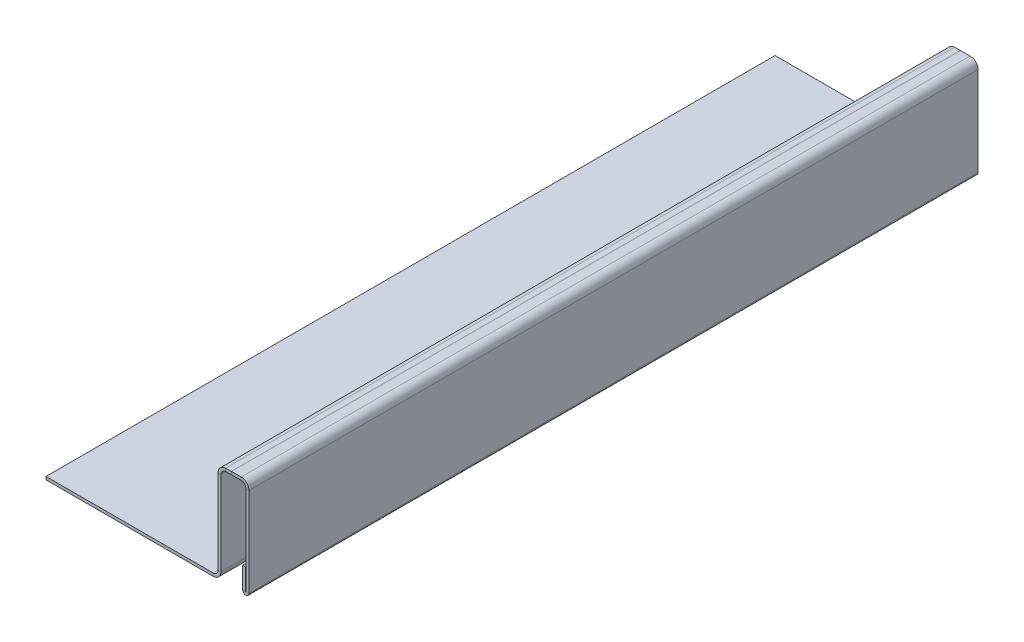
ISO-10303-21;
HEADER;
FILE_DESCRIPTION(('STEP AP214'),'2;1');
FILE_NAME('part.step','',(''),(''),'','','');
FILE_SCHEMA(('AUTOMOTIVE_DESIGN { 1 0 10303 214 1 1 1 1 }'));
ENDSEC;
DATA;
#1=APPLICATION_CONTEXT('core data for automotive mechanical design processes');
#2=APPLICATION_PROTOCOL_DEFINITION('international standard','automotive_design',2000,#1);
#3=PRODUCT_CONTEXT('',#1,'mechanical');
#4=PRODUCT('Part','Part','',(#3));
#5=PRODUCT_RELATED_PRODUCT_CATEGORY('part','',(#4));
#6=PRODUCT_DEFINITION_FORMATION('','',#4);
#7=PRODUCT_DEFINITION_CONTEXT('part definition',#1,'design');
#8=PRODUCT_DEFINITION('design','',#6,#7);
#9=PRODUCT_DEFINITION_SHAPE('','',#8);
#10=(LENGTH_UNIT() NAMED_UNIT(*) SI_UNIT(.MILLI.,.METRE.));
#11=(NAMED_UNIT(*) PLANE_ANGLE_UNIT() SI_UNIT($,.RADIAN.));
#12=(NAMED_UNIT(*) SI_UNIT($,.STERADIAN.) SOLID_ANGLE_UNIT());
#13=UNCERTAINTY_MEASURE_WITH_UNIT(LENGTH_MEASURE(1.E-05),#10,'distance_accuracy_value','');
#14=(GEOMETRIC_REPRESENTATION_CONTEXT(3) GLOBAL_UNCERTAINTY_ASSIGNED_CONTEXT((#13)) GLOBAL_UNIT_ASSIGNED_CONTEXT((#10,
#11,#12)) REPRESENTATION_CONTEXT('',''));
#15=CARTESIAN_POINT('',(0.,0.,0.));
#16=DIRECTION('',(0.,0.,1.));
#17=DIRECTION('',(1.,0.,0.));
#18=AXIS2_PLACEMENT_3D('',#15,#16,#17);
#19=CARTESIAN_POINT('',(0.6,0.,0.));
#20=DIRECTION('',(1.,0.,0.));
#21=DIRECTION('',(0.,0.,-1.));
#22=AXIS2_PLACEMENT_3D('',#19,#20,#21);
#23=PLANE('',#22);
#24=DIRECTION('',(0.,-1.,0.));
#25=VECTOR('',#24,1.);
#26=CARTESIAN_POINT('',(0.6,-40.,75.));
#27=LINE('',#26,#25);
#28=CARTESIAN_POINT('',(0.6,13.7689704673279,74.9999999999999));
#29=VERTEX_POINT('',#28);
#30=CARTESIAN_POINT('',(0.6,-3.56845827696273,75.));
#31=VERTEX_POINT('',#30);
#32=EDGE_CURVE('E62',#29,#31,#27,.T.);
#33=ORIENTED_EDGE('',*,*,#32,.T.);
#34=DIRECTION('',(0.,0.,-1.));
#35=VECTOR('',#34,1.);
#36=CARTESIAN_POINT('',(0.6,-3.56845827696275,0.));
#37=LINE('',#36,#35);
#38=CARTESIAN_POINT('',(0.6,-3.56845827696276,-75.));
#39=VERTEX_POINT('',#38);
#40=EDGE_CURVE('E449',#31,#39,#37,.T.);
#41=ORIENTED_EDGE('',*,*,#40,.T.);
#42=DIRECTION('',(0.,1.,0.));
#43=VECTOR('',#42,1.);
#44=CARTESIAN_POINT('',(0.6,-40.,-75.));
#45=LINE('',#44,#43);
#46=CARTESIAN_POINT('',(0.6,13.7689704673279,-75.));
#47=VERTEX_POINT('',#46);
#48=EDGE_CURVE('E282',#39,#47,#45,.T.);
#49=ORIENTED_EDGE('',*,*,#48,.T.);
#50=DIRECTION('',(0.,0.,1.));
#51=VECTOR('',#50,1.);
#52=CARTESIAN_POINT('',(0.6,13.7689704673279,0.));
#53=LINE('',#52,#51);
#54=EDGE_CURVE('E279',#47,#29,#53,.T.);
#55=ORIENTED_EDGE('',*,*,#54,.T.);
#56=EDGE_LOOP('',(#33,#41,#49,#55));
#57=FACE_BOUND('',#56,.T.);
#58=ADVANCED_FACE('F58',(#57),#23,.T.);
#59=CARTESIAN_POINT('',(-54.1665557150002,12.8221689741547,-75.));
#60=DIRECTION('',(0.,0.,1.));
#61=DIRECTION('',(0.0348994967024975,-0.999390827019096,0.));
#62=AXIS2_PLACEMENT_3D('',#59,#60,#61);
#63=PLANE('',#62);
#64=DIRECTION('',(0.999390827019096,0.0348994967024975,0.));
#65=VECTOR('',#64,1.);
#66=CARTESIAN_POINT('',(-54.1665557150002,12.8221689741547,-75.));
#67=LINE('',#66,#65);
#68=CARTESIAN_POINT('',(1.5651005032975,14.768361294347,-75.));
#69=VERTEX_POINT('',#68);
#70=CARTESIAN_POINT('',(2.7550411574538,14.8099149376397,-75.));
#71=VERTEX_POINT('',#70);
#72=EDGE_CURVE('E308',#69,#71,#67,.T.);
#73=ORIENTED_EDGE('',*,*,#72,.F.);
#74=DIRECTION('',(-0.0348994967024975,0.999390827019096,0.));
#75=VECTOR('',#74,1.);
#76=CARTESIAN_POINT('',(1.5651005032975,14.768361294347,-75.));
#77=LINE('',#76,#75);
#78=CARTESIAN_POINT('',(1.544160805276,15.3679957905585,-75.));
#79=VERTEX_POINT('',#78);
#80=EDGE_CURVE('E446',#69,#79,#77,.T.);
#81=ORIENTED_EDGE('',*,*,#80,.T.);
#82=DIRECTION('',(0.999390827019096,0.0348994967024975,0.));
#83=VECTOR('',#82,1.);
#84=CARTESIAN_POINT('',(-54.1874954130217,13.4218034703662,-75.));
#85=LINE('',#84,#83);
#86=CARTESIAN_POINT('',(2.7341014594323,15.4095494338511,-75.));
#87=VERTEX_POINT('',#86);
#88=EDGE_CURVE('E328',#79,#87,#85,.T.);
#89=ORIENTED_EDGE('',*,*,#88,.T.);
#90=DIRECTION('',(-0.0348994967024975,0.999390827019096,0.));
#91=VECTOR('',#90,1.);
#92=CARTESIAN_POINT('',(2.7550411574538,14.8099149376397,-75.));
#93=LINE('',#92,#91);
#94=EDGE_CURVE('E298',#71,#87,#93,.T.);
#95=ORIENTED_EDGE('',*,*,#94,.F.);
#96=EDGE_LOOP('',(#73,#81,#89,#95));
#97=FACE_BOUND('',#96,.T.);
#98=ADVANCED_FACE('F480',(#97),#63,.F.);
#99=CARTESIAN_POINT('',(-14.2118623322578,14.8177833384661,0.));
#100=DIRECTION('',(0.0348994967024975,-0.999390827019096,0.));
#101=DIRECTION('',(0.,0.,-1.));
#102=AXIS2_PLACEMENT_3D('',#99,#100,#101);
#103=PLANE('',#102);
#104=ORIENTED_EDGE('',*,*,#88,.F.);
#105=DIRECTION('',(0.,0.,1.));
#106=VECTOR('',#105,1.);
#107=CARTESIAN_POINT('',(1.544160805276,15.3679957905585,0.));
#108=LINE('',#107,#106);
#109=CARTESIAN_POINT('',(1.54416080527601,15.3679957905585,75.));
#110=VERTEX_POINT('',#109);
#111=EDGE_CURVE('E443',#79,#110,#108,.T.);
#112=ORIENTED_EDGE('',*,*,#111,.T.);
#113=DIRECTION('',(-0.999390827019096,-0.0348994967024975,0.));
#114=VECTOR('',#113,1.);
#115=CARTESIAN_POINT('',(-54.1874954130217,13.4218034703662,75.));
#116=LINE('',#115,#114);
#117=CARTESIAN_POINT('',(2.73410145943231,15.4095494338511,75.));
#118=VERTEX_POINT('',#117);
#119=EDGE_CURVE('E451',#118,#110,#116,.T.);
#120=ORIENTED_EDGE('',*,*,#119,.F.);
#121=DIRECTION('',(0.,0.,1.));
#122=VECTOR('',#121,1.);
#123=CARTESIAN_POINT('',(2.7341014594323,15.4095494338511,0.));
#124=LINE('',#123,#122);
#125=EDGE_CURVE('E312',#87,#118,#124,.T.);
#126=ORIENTED_EDGE('',*,*,#125,.F.);
#127=EDGE_LOOP('',(#104,#112,#120,#126));
#128=FACE_BOUND('',#127,.T.);
#129=ADVANCED_FACE('F488',(#128),#103,.F.);
#130=CARTESIAN_POINT('',(-54.1665557150002,12.8221689741547,75.));
#131=DIRECTION('',(0.,0.,-1.));
#132=DIRECTION('',(-0.0348994967024975,0.999390827019096,0.));
#133=AXIS2_PLACEMENT_3D('',#130,#131,#132);
#134=PLANE('',#133);
#135=ORIENTED_EDGE('',*,*,#119,.T.);
#136=DIRECTION('',(0.0348994967024975,-0.999390827019096,0.));
#137=VECTOR('',#136,1.);
#138=CARTESIAN_POINT('',(1.5651005032975,14.768361294347,75.));
#139=LINE('',#138,#137);
#140=CARTESIAN_POINT('',(1.5651005032975,14.768361294347,74.9999999999999));
#141=VERTEX_POINT('',#140);
#142=EDGE_CURVE('E441',#110,#141,#139,.T.);
#143=ORIENTED_EDGE('',*,*,#142,.T.);
#144=DIRECTION('',(-0.999390827019096,-0.0348994967024975,0.));
#145=VECTOR('',#144,1.);
#146=CARTESIAN_POINT('',(-54.1665557150002,12.8221689741547,75.));
#147=LINE('',#146,#145);
#148=CARTESIAN_POINT('',(2.7550411574538,14.8099149376397,75.));
#149=VERTEX_POINT('',#148);
#150=EDGE_CURVE('E307',#149,#141,#147,.T.);
#151=ORIENTED_EDGE('',*,*,#150,.F.);
#152=DIRECTION('',(0.0348994967024975,-0.999390827019096,0.));
#153=VECTOR('',#152,1.);
#154=CARTESIAN_POINT('',(2.7550411574538,14.8099149376397,75.));
#155=LINE('',#154,#153);
#156=EDGE_CURVE('E309',#118,#149,#155,.T.);
#157=ORIENTED_EDGE('',*,*,#156,.F.);
#158=EDGE_LOOP('',(#135,#143,#151,#157));
#159=FACE_BOUND('',#158,.T.);
#160=ADVANCED_FACE('F493',(#159),#134,.F.);
#161=CARTESIAN_POINT('',(-54.211731013703,14.8105241106208,-75.));
#162=DIRECTION('',(0.,0.,1.));
#163=DIRECTION('',(0.,-1.,0.));
#164=AXIS2_PLACEMENT_3D('',#161,#162,#163);
#165=PLANE('',#164);
#166=DIRECTION('',(1.,0.,0.));
#167=VECTOR('',#166,1.);
#168=CARTESIAN_POINT('',(-54.211731013703,14.8105241106208,-75.));
#169=LINE('',#168,#167);
#170=CARTESIAN_POINT('',(2.7899406541563,14.8105241106206,-75.));
#171=VERTEX_POINT('',#170);
#172=CARTESIAN_POINT('',(4.76725137388036,14.8105241106206,-75.));
#173=VERTEX_POINT('',#172);
#174=EDGE_CURVE('E335',#171,#173,#169,.T.);
#175=ORIENTED_EDGE('',*,*,#174,.F.);
#176=DIRECTION('',(0.,1.,0.));
#177=VECTOR('',#176,1.);
#178=CARTESIAN_POINT('',(2.7899406541563,14.8105241106206,-75.));
#179=LINE('',#178,#177);
#180=CARTESIAN_POINT('',(2.7899406541563,15.4105241106206,-75.));
#181=VERTEX_POINT('',#180);
#182=EDGE_CURVE('E429',#171,#181,#179,.T.);
#183=ORIENTED_EDGE('',*,*,#182,.T.);
#184=DIRECTION('',(1.,0.,0.));
#185=VECTOR('',#184,1.);
#186=CARTESIAN_POINT('',(-54.211731013703,15.4105241106208,-75.));
#187=LINE('',#186,#185);
#188=CARTESIAN_POINT('',(4.76725137388036,15.4105241106206,-75.));
#189=VERTEX_POINT('',#188);
#190=EDGE_CURVE('E363',#181,#189,#187,.T.);
#191=ORIENTED_EDGE('',*,*,#190,.T.);
#192=DIRECTION('',(0.,1.,0.));
#193=VECTOR('',#192,1.);
#194=CARTESIAN_POINT('',(4.76725137388036,14.8105241106206,-75.));
#195=LINE('',#194,#193);
#196=EDGE_CURVE('E324',#173,#189,#195,.T.);
#197=ORIENTED_EDGE('',*,*,#196,.F.);
#198=EDGE_LOOP('',(#175,#183,#191,#197));
#199=FACE_BOUND('',#198,.T.);
#200=ADVANCED_FACE('F511',(#199),#165,.F.);
#201=CARTESIAN_POINT('',(-14.211731013703,15.4105241106206,0.));
#202=DIRECTION('',(0.,-1.,0.));
#203=DIRECTION('',(0.,0.,-1.));
#204=AXIS2_PLACEMENT_3D('',#201,#202,#203);
#205=PLANE('',#204);
#206=ORIENTED_EDGE('',*,*,#190,.F.);
#207=DIRECTION('',(0.,0.,1.));
#208=VECTOR('',#207,1.);
#209=CARTESIAN_POINT('',(2.7899406541563,15.4105241106206,0.));
#210=LINE('',#209,#208);
#211=CARTESIAN_POINT('',(2.78994065415631,15.4105241106206,75.));
#212=VERTEX_POINT('',#211);
#213=EDGE_CURVE('E426',#181,#212,#210,.T.);
#214=ORIENTED_EDGE('',*,*,#213,.T.);
#215=DIRECTION('',(-1.,0.,0.));
#216=VECTOR('',#215,1.);
#217=CARTESIAN_POINT('',(-54.211731013703,15.4105241106208,75.));
#218=LINE('',#217,#216);
#219=CARTESIAN_POINT('',(4.76725137388038,15.4105241106206,75.));
#220=VERTEX_POINT('',#219);
#221=EDGE_CURVE('E434',#220,#212,#218,.T.);
#222=ORIENTED_EDGE('',*,*,#221,.F.);
#223=DIRECTION('',(0.,0.,1.));
#224=VECTOR('',#223,1.);
#225=CARTESIAN_POINT('',(4.76725137388037,15.4105241106206,0.));
#226=LINE('',#225,#224);
#227=EDGE_CURVE('E339',#189,#220,#226,.T.);
#228=ORIENTED_EDGE('',*,*,#227,.F.);
#229=EDGE_LOOP('',(#206,#214,#222,#228));
#230=FACE_BOUND('',#229,.T.);
#231=ADVANCED_FACE('F520',(#230),#205,.F.);
#232=CARTESIAN_POINT('',(-54.211731013703,14.8105241106208,75.));
#233=DIRECTION('',(0.,0.,-1.));
#234=DIRECTION('',(0.,1.,0.));
#235=AXIS2_PLACEMENT_3D('',#232,#233,#234);
#236=PLANE('',#235);
#237=ORIENTED_EDGE('',*,*,#221,.T.);
#238=DIRECTION('',(0.,-1.,0.));
#239=VECTOR('',#238,1.);
#240=CARTESIAN_POINT('',(2.7899406541563,14.8105241106206,75.));
#241=LINE('',#240,#239);
#242=CARTESIAN_POINT('',(2.7899406541563,14.8105241106206,75.));
#243=VERTEX_POINT('',#242);
#244=EDGE_CURVE('E424',#212,#243,#241,.T.);
#245=ORIENTED_EDGE('',*,*,#244,.T.);
#246=DIRECTION('',(-1.,0.,0.));
#247=VECTOR('',#246,1.);
#248=CARTESIAN_POINT('',(-54.211731013703,14.8105241106208,75.));
#249=LINE('',#248,#247);
#250=CARTESIAN_POINT('',(4.76725137388036,14.8105241106206,75.));
#251=VERTEX_POINT('',#250);
#252=EDGE_CURVE('E334',#251,#243,#249,.T.);
#253=ORIENTED_EDGE('',*,*,#252,.F.);
#254=DIRECTION('',(0.,-1.,0.));
#255=VECTOR('',#254,1.);
#256=CARTESIAN_POINT('',(4.76725137388036,14.8105241106206,75.));
#257=LINE('',#256,#255);
#258=EDGE_CURVE('E336',#220,#251,#257,.T.);
#259=ORIENTED_EDGE('',*,*,#258,.F.);
#260=EDGE_LOOP('',(#237,#245,#253,#259));
#261=FACE_BOUND('',#260,.T.);
#262=ADVANCED_FACE('F524',(#261),#236,.F.);
#263=CARTESIAN_POINT('',(6.36725137388052,34.8315417230373,0.));
#264=DIRECTION('',(-1.,0.,0.));
#265=DIRECTION('',(0.,0.,-1.));
#266=AXIS2_PLACEMENT_3D('',#263,#264,#265);
#267=PLANE('',#266);
#268=DIRECTION('',(0.,-1.,0.));
#269=VECTOR('',#268,1.);
#270=CARTESIAN_POINT('',(6.3672513738808,74.8315417230373,-75.));
#271=LINE('',#270,#269);
#272=CARTESIAN_POINT('',(6.36725137388037,13.8105241106206,-75.));
#273=VERTEX_POINT('',#272);
#274=CARTESIAN_POINT('',(6.36725137388024,-4.51845827696273,-75.));
#275=VERTEX_POINT('',#274);
#276=EDGE_CURVE('E415',#273,#275,#271,.T.);
#277=ORIENTED_EDGE('',*,*,#276,.F.);
#278=DIRECTION('',(0.,0.,1.));
#279=VECTOR('',#278,1.);
#280=CARTESIAN_POINT('',(6.36725137388037,13.8105241106206,0.));
#281=LINE('',#280,#279);
#282=CARTESIAN_POINT('',(6.36725137388037,13.8105241106205,75.));
#283=VERTEX_POINT('',#282);
#284=EDGE_CURVE('E408',#273,#283,#281,.T.);
#285=ORIENTED_EDGE('',*,*,#284,.T.);
#286=DIRECTION('',(0.,1.,0.));
#287=VECTOR('',#286,1.);
#288=CARTESIAN_POINT('',(6.3672513738808,74.8315417230372,75.));
#289=LINE('',#288,#287);
#290=CARTESIAN_POINT('',(6.36725137388025,-4.51845827696277,75.));
#291=VERTEX_POINT('',#290);
#292=EDGE_CURVE('E400',#291,#283,#289,.T.);
#293=ORIENTED_EDGE('',*,*,#292,.F.);
#294=DIRECTION('',(0.,0.,1.));
#295=VECTOR('',#294,1.);
#296=CARTESIAN_POINT('',(6.36725137388025,-4.51845827696277,75.));
#297=LINE('',#296,#295);
#298=EDGE_CURVE('E344',#291,#275,#297,.F.);
#299=ORIENTED_EDGE('',*,*,#298,.T.);
#300=EDGE_LOOP('',(#277,#285,#293,#299));
#301=FACE_BOUND('',#300,.T.);
#302=ADVANCED_FACE('F552',(#301),#267,.F.);
#303=CARTESIAN_POINT('',(5.7672513738808,74.8315417230373,-75.));
#304=DIRECTION('',(0.,0.,1.));
#305=DIRECTION('',(-1.,0.,0.));
#306=AXIS2_PLACEMENT_3D('',#303,#304,#305);
#307=PLANE('',#306);
#308=DIRECTION('',(0.,-1.,0.));
#309=VECTOR('',#308,1.);
#310=CARTESIAN_POINT('',(5.7672513738808,74.8315417230373,-75.));
#311=LINE('',#310,#309);
#312=CARTESIAN_POINT('',(5.76725137388037,13.8105241106206,-75.));
#313=VERTEX_POINT('',#312);
#314=CARTESIAN_POINT('',(5.76725137388024,-4.51845827696273,-75.));
#315=VERTEX_POINT('',#314);
#316=EDGE_CURVE('E406',#313,#315,#311,.T.);
#317=ORIENTED_EDGE('',*,*,#316,.F.);
#318=DIRECTION('',(1.,0.,0.));
#319=VECTOR('',#318,1.);
#320=CARTESIAN_POINT('',(5.76725137388037,13.8105241106206,-75.));
#321=LINE('',#320,#319);
#322=EDGE_CURVE('E411',#313,#273,#321,.T.);
#323=ORIENTED_EDGE('',*,*,#322,.T.);
#324=ORIENTED_EDGE('',*,*,#276,.T.);
#325=DIRECTION('',(1.,0.,0.));
#326=VECTOR('',#325,1.);
#327=CARTESIAN_POINT('',(5.76725137388024,-4.51845827696273,-75.));
#328=LINE('',#327,#326);
#329=EDGE_CURVE('E364',#315,#275,#328,.T.);
#330=ORIENTED_EDGE('',*,*,#329,.F.);
#331=EDGE_LOOP('',(#317,#323,#324,#330));
#332=FACE_BOUND('',#331,.T.);
#333=ADVANCED_FACE('F549',(#332),#307,.F.);
#334=CARTESIAN_POINT('',(5.7672513738808,74.8315417230372,75.));
#335=DIRECTION('',(0.,0.,-1.));
#336=DIRECTION('',(1.,0.,0.));
#337=AXIS2_PLACEMENT_3D('',#334,#335,#336);
#338=PLANE('',#337);
#339=ORIENTED_EDGE('',*,*,#292,.T.);
#340=DIRECTION('',(-1.,0.,0.));
#341=VECTOR('',#340,1.);
#342=CARTESIAN_POINT('',(5.76725137388037,13.8105241106206,75.));
#343=LINE('',#342,#341);
#344=CARTESIAN_POINT('',(5.76725137388036,13.8105241106205,75.));
#345=VERTEX_POINT('',#344);
#346=EDGE_CURVE('E405',#283,#345,#343,.T.);
#347=ORIENTED_EDGE('',*,*,#346,.T.);
#348=DIRECTION('',(0.,1.,0.));
#349=VECTOR('',#348,1.);
#350=CARTESIAN_POINT('',(5.7672513738808,74.8315417230372,75.));
#351=LINE('',#350,#349);
#352=CARTESIAN_POINT('',(5.76725137388024,-4.51845827696276,75.));
#353=VERTEX_POINT('',#352);
#354=EDGE_CURVE('E417',#353,#345,#351,.T.);
#355=ORIENTED_EDGE('',*,*,#354,.F.);
#356=DIRECTION('',(1.,0.,0.));
#357=VECTOR('',#356,1.);
#358=CARTESIAN_POINT('',(5.76725137388024,-4.51845827696276,75.));
#359=LINE('',#358,#357);
#360=EDGE_CURVE('E351',#353,#291,#359,.T.);
#361=ORIENTED_EDGE('',*,*,#360,.T.);
#362=EDGE_LOOP('',(#339,#347,#355,#361));
#363=FACE_BOUND('',#362,.T.);
#364=ADVANCED_FACE('F536',(#363),#338,.F.);
#365=CARTESIAN_POINT('',(5.76725137388052,34.8315417230373,0.));
#366=DIRECTION('',(-1.,0.,0.));
#367=DIRECTION('',(0.,0.,-1.));
#368=AXIS2_PLACEMENT_3D('',#365,#366,#367);
#369=PLANE('',#368);
#370=DIRECTION('',(0.,0.,1.));
#371=VECTOR('',#370,1.);
#372=CARTESIAN_POINT('',(5.76725137388037,13.8105241106206,0.));
#373=LINE('',#372,#371);
#374=EDGE_CURVE('E402',#313,#345,#373,.T.);
#375=ORIENTED_EDGE('',*,*,#374,.F.);
#376=ORIENTED_EDGE('',*,*,#316,.T.);
#377=DIRECTION('',(0.,0.,1.));
#378=VECTOR('',#377,1.);
#379=CARTESIAN_POINT('',(5.76725137388024,-4.51845827696276,75.));
#380=LINE('',#379,#378);
#381=EDGE_CURVE('E357',#353,#315,#380,.F.);
#382=ORIENTED_EDGE('',*,*,#381,.F.);
#383=ORIENTED_EDGE('',*,*,#354,.T.);
#384=EDGE_LOOP('',(#375,#376,#382,#383));
#385=FACE_BOUND('',#384,.T.);
#386=ADVANCED_FACE('F540',(#385),#369,.T.);
#387=CARTESIAN_POINT('',(5.06725137388026,-2.34345827696275,75.));
#388=DIRECTION('',(0.,0.,-1.));
#389=DIRECTION('',(0.,-1.,0.));
#390=AXIS2_PLACEMENT_3D('',#387,#388,#389);
#391=PLANE('',#390);
#392=DIRECTION('',(-1.,0.,0.));
#393=VECTOR('',#392,1.);
#394=CARTESIAN_POINT('',(5.06725137388025,-4.51845827696275,75.));
#395=LINE('',#394,#393);
#396=CARTESIAN_POINT('',(5.66725137388024,-4.51845827696277,75.));
#397=VERTEX_POINT('',#396);
#398=CARTESIAN_POINT('',(5.06725137388025,-4.51845827696275,75.));
#399=VERTEX_POINT('',#398);
#400=EDGE_CURVE('E394',#397,#399,#395,.T.);
#401=ORIENTED_EDGE('',*,*,#400,.F.);
#402=DIRECTION('',(0.,-1.,0.));
#403=VECTOR('',#402,1.);
#404=CARTESIAN_POINT('',(5.66725137388026,-2.34345827696277,75.));
#405=LINE('',#404,#403);
#406=CARTESIAN_POINT('',(5.66725137388027,-0.168458276962756,75.));
#407=VERTEX_POINT('',#406);
#408=EDGE_CURVE('E385',#407,#397,#405,.T.);
#409=ORIENTED_EDGE('',*,*,#408,.F.);
#410=DIRECTION('',(-1.,0.,0.));
#411=VECTOR('',#410,1.);
#412=CARTESIAN_POINT('',(5.06725137388028,-0.168458276962751,75.));
#413=LINE('',#412,#411);
#414=CARTESIAN_POINT('',(5.06725137388028,-0.168458276962751,75.));
#415=VERTEX_POINT('',#414);
#416=EDGE_CURVE('E392',#407,#415,#413,.T.);
#417=ORIENTED_EDGE('',*,*,#416,.T.);
#418=DIRECTION('',(0.,-1.,0.));
#419=VECTOR('',#418,1.);
#420=CARTESIAN_POINT('',(5.06725137388026,-2.34345827696275,75.));
#421=LINE('',#420,#419);
#422=EDGE_CURVE('E373',#415,#399,#421,.T.);
#423=ORIENTED_EDGE('',*,*,#422,.T.);
#424=EDGE_LOOP('',(#401,#409,#417,#423));
#425=FACE_BOUND('',#424,.T.);
#426=ADVANCED_FACE('F567',(#425),#391,.F.);
#427=CARTESIAN_POINT('',(5.06725137388027,-0.168458276962741,0.));
#428=DIRECTION('',(0.,-1.,0.));
#429=DIRECTION('',(0.,0.,1.));
#430=AXIS2_PLACEMENT_3D('',#427,#428,#429);
#431=PLANE('',#430);
#432=ORIENTED_EDGE('',*,*,#416,.F.);
#433=DIRECTION('',(0.,0.,-1.));
#434=VECTOR('',#433,1.);
#435=CARTESIAN_POINT('',(5.66725137388027,-0.168458276962755,0.));
#436=LINE('',#435,#434);
#437=CARTESIAN_POINT('',(5.66725137388027,-0.168458276962742,-75.));
#438=VERTEX_POINT('',#437);
#439=EDGE_CURVE('E382',#438,#407,#436,.F.);
#440=ORIENTED_EDGE('',*,*,#439,.F.);
#441=DIRECTION('',(-1.,0.,0.));
#442=VECTOR('',#441,1.);
#443=CARTESIAN_POINT('',(5.06725137388027,-0.168458276962732,-75.));
#444=LINE('',#443,#442);
#445=CARTESIAN_POINT('',(5.06725137388027,-0.168458276962732,-75.));
#446=VERTEX_POINT('',#445);
#447=EDGE_CURVE('E372',#438,#446,#444,.T.);
#448=ORIENTED_EDGE('',*,*,#447,.T.);
#449=DIRECTION('',(0.,0.,1.));
#450=VECTOR('',#449,1.);
#451=CARTESIAN_POINT('',(5.06725137388027,-0.168458276962741,0.));
#452=LINE('',#451,#450);
#453=EDGE_CURVE('E369',#446,#415,#452,.T.);
#454=ORIENTED_EDGE('',*,*,#453,.T.);
#455=EDGE_LOOP('',(#432,#440,#448,#454));
#456=FACE_BOUND('',#455,.T.);
#457=ADVANCED_FACE('F582',(#456),#431,.F.);
#458=CARTESIAN_POINT('',(5.06725137388026,-2.34345827696273,-75.));
#459=DIRECTION('',(0.,0.,1.));
#460=DIRECTION('',(0.,1.,0.));
#461=AXIS2_PLACEMENT_3D('',#458,#459,#460);
#462=PLANE('',#461);
#463=DIRECTION('',(0.,-1.,0.));
#464=VECTOR('',#463,1.);
#465=CARTESIAN_POINT('',(5.66725137388026,-2.34345827696273,-75.));
#466=LINE('',#465,#464);
#467=CARTESIAN_POINT('',(5.66725137388024,-4.51845827696275,-75.));
#468=VERTEX_POINT('',#467);
#469=EDGE_CURVE('E367',#468,#438,#466,.F.);
#470=ORIENTED_EDGE('',*,*,#469,.F.);
#471=DIRECTION('',(-1.,0.,0.));
#472=VECTOR('',#471,1.);
#473=CARTESIAN_POINT('',(5.06725137388025,-4.51845827696273,-75.));
#474=LINE('',#473,#472);
#475=CARTESIAN_POINT('',(5.06725137388025,-4.51845827696272,-75.));
#476=VERTEX_POINT('',#475);
#477=EDGE_CURVE('E397',#468,#476,#474,.T.);
#478=ORIENTED_EDGE('',*,*,#477,.T.);
#479=DIRECTION('',(0.,1.,0.));
#480=VECTOR('',#479,1.);
#481=CARTESIAN_POINT('',(5.06725137388026,-2.34345827696273,-75.));
#482=LINE('',#481,#480);
#483=EDGE_CURVE('E379',#476,#446,#482,.T.);
#484=ORIENTED_EDGE('',*,*,#483,.T.);
#485=ORIENTED_EDGE('',*,*,#447,.F.);
#486=EDGE_LOOP('',(#470,#478,#484,#485));
#487=FACE_BOUND('',#486,.T.);
#488=ADVANCED_FACE('F580',(#487),#462,.F.);
#489=CARTESIAN_POINT('',(5.06725137388026,-2.34345827696274,0.));
#490=DIRECTION('',(-1.,0.,0.));
#491=DIRECTION('',(0.,0.,-1.));
#492=AXIS2_PLACEMENT_3D('',#489,#490,#491);
#493=PLANE('',#492);
#494=ORIENTED_EDGE('',*,*,#453,.F.);
#495=ORIENTED_EDGE('',*,*,#483,.F.);
#496=DIRECTION('',(0.,0.,-1.));
#497=VECTOR('',#496,1.);
#498=CARTESIAN_POINT('',(5.06725137388025,-4.51845827696274,0.));
#499=LINE('',#498,#497);
#500=EDGE_CURVE('E376',#399,#476,#499,.T.);
#501=ORIENTED_EDGE('',*,*,#500,.F.);
#502=ORIENTED_EDGE('',*,*,#422,.F.);
#503=EDGE_LOOP('',(#494,#495,#501,#502));
#504=FACE_BOUND('',#503,.T.);
#505=ADVANCED_FACE('F565',(#504),#493,.T.);
#506=CARTESIAN_POINT('',(5.66725137388026,-2.34345827696275,0.));
#507=DIRECTION('',(-1.,0.,0.));
#508=DIRECTION('',(0.,0.,-1.));
#509=AXIS2_PLACEMENT_3D('',#506,#507,#508);
#510=PLANE('',#509);
#511=ORIENTED_EDGE('',*,*,#439,.T.);
#512=ORIENTED_EDGE('',*,*,#408,.T.);
#513=DIRECTION('',(0.,0.,-1.));
#514=VECTOR('',#513,1.);
#515=CARTESIAN_POINT('',(5.66725137388024,-4.51845827696275,0.));
#516=LINE('',#515,#514);
#517=EDGE_CURVE('E388',#397,#468,#516,.T.);
#518=ORIENTED_EDGE('',*,*,#517,.T.);
#519=ORIENTED_EDGE('',*,*,#469,.T.);
#520=EDGE_LOOP('',(#511,#512,#518,#519));
#521=FACE_BOUND('',#520,.T.);
#522=ADVANCED_FACE('F577',(#521),#510,.F.);
#523=CARTESIAN_POINT('',(5.71725137388024,-4.51845827696273,-75.));
#524=DIRECTION('',(0.,0.,-1.));
#525=DIRECTION('',(1.,0.,0.));
#526=AXIS2_PLACEMENT_3D('',#523,#524,#525);
#527=PLANE('',#526);
#528=ORIENTED_EDGE('',*,*,#477,.F.);
#529=CARTESIAN_POINT('',(5.71725137388024,-4.51845827696273,-75.));
#530=DIRECTION('',(0.,0.,1.));
#531=DIRECTION('',(-1.,0.,0.));
#532=AXIS2_PLACEMENT_3D('',#529,#530,#531);
#533=CIRCLE('',#532,0.05);
#534=EDGE_CURVE('E354',#315,#468,#533,.F.);
#535=ORIENTED_EDGE('',*,*,#534,.F.);
#536=ORIENTED_EDGE('',*,*,#329,.T.);
#537=CARTESIAN_POINT('',(5.71725137388024,-4.51845827696273,-75.));
#538=DIRECTION('',(0.,0.,1.));
#539=DIRECTION('',(-1.,0.,0.));
#540=AXIS2_PLACEMENT_3D('',#537,#538,#539);
#541=CIRCLE('',#540,0.65);
#542=EDGE_CURVE('E347',#275,#476,#541,.F.);
#543=ORIENTED_EDGE('',*,*,#542,.T.);
#544=EDGE_LOOP('',(#528,#535,#536,#543));
#545=FACE_BOUND('',#544,.T.);
#546=ADVANCED_FACE('F560',(#545),#527,.T.);
#547=CARTESIAN_POINT('',(5.71725137388024,-4.51845827696277,75.));
#548=DIRECTION('',(0.,0.,-1.));
#549=DIRECTION('',(1.,0.,0.));
#550=AXIS2_PLACEMENT_3D('',#547,#548,#549);
#551=PLANE('',#550);
#552=CARTESIAN_POINT('',(5.71725137388024,-4.51845827696277,75.));
#553=DIRECTION('',(0.,0.,1.));
#554=DIRECTION('',(-1.,0.,0.));
#555=AXIS2_PLACEMENT_3D('',#552,#553,#554);
#556=CIRCLE('',#555,0.05);
#557=EDGE_CURVE('E360',#397,#353,#556,.T.);
#558=ORIENTED_EDGE('',*,*,#557,.F.);
#559=ORIENTED_EDGE('',*,*,#400,.T.);
#560=CARTESIAN_POINT('',(5.71725137388024,-4.51845827696277,75.));
#561=DIRECTION('',(0.,0.,1.));
#562=DIRECTION('',(-1.,0.,0.));
#563=AXIS2_PLACEMENT_3D('',#560,#561,#562);
#564=CIRCLE('',#563,0.65);
#565=EDGE_CURVE('E348',#399,#291,#564,.T.);
#566=ORIENTED_EDGE('',*,*,#565,.T.);
#567=ORIENTED_EDGE('',*,*,#360,.F.);
#568=EDGE_LOOP('',(#558,#559,#566,#567));
#569=FACE_BOUND('',#568,.T.);
#570=ADVANCED_FACE('F571',(#569),#551,.F.);
#571=CARTESIAN_POINT('',(5.71725137388024,-4.51845827696277,75.));
#572=DIRECTION('',(0.,0.,1.));
#573=DIRECTION('',(-1.,0.,0.));
#574=AXIS2_PLACEMENT_3D('',#571,#572,#573);
#575=CYLINDRICAL_SURFACE('',#574,0.65);
#576=ORIENTED_EDGE('',*,*,#298,.F.);
#577=ORIENTED_EDGE('',*,*,#565,.F.);
#578=ORIENTED_EDGE('',*,*,#500,.T.);
#579=ORIENTED_EDGE('',*,*,#542,.F.);
#580=EDGE_LOOP('',(#576,#577,#578,#579));
#581=FACE_BOUND('',#580,.T.);
#582=ADVANCED_FACE('F561',(#581),#575,.T.);
#583=CARTESIAN_POINT('',(5.71725137388024,-4.51845827696277,75.));
#584=DIRECTION('',(0.,0.,1.));
#585=DIRECTION('',(-1.,0.,0.));
#586=AXIS2_PLACEMENT_3D('',#583,#584,#585);
#587=CYLINDRICAL_SURFACE('',#586,0.05);
#588=ORIENTED_EDGE('',*,*,#381,.T.);
#589=ORIENTED_EDGE('',*,*,#534,.T.);
#590=ORIENTED_EDGE('',*,*,#517,.F.);
#591=ORIENTED_EDGE('',*,*,#557,.T.);
#592=EDGE_LOOP('',(#588,#589,#590,#591));
#593=FACE_BOUND('',#592,.T.);
#594=ADVANCED_FACE('F574',(#593),#587,.F.);
#595=CARTESIAN_POINT('',(-14.211731013703,14.8105241106206,0.));
#596=DIRECTION('',(0.,-1.,0.));
#597=DIRECTION('',(0.,0.,-1.));
#598=AXIS2_PLACEMENT_3D('',#595,#596,#597);
#599=PLANE('',#598);
#600=DIRECTION('',(0.,0.,1.));
#601=VECTOR('',#600,1.);
#602=CARTESIAN_POINT('',(2.7899406541563,14.8105241106206,0.));
#603=LINE('',#602,#601);
#604=EDGE_CURVE('E414',#171,#243,#603,.T.);
#605=ORIENTED_EDGE('',*,*,#604,.F.);
#606=ORIENTED_EDGE('',*,*,#174,.T.);
#607=DIRECTION('',(0.,0.,1.));
#608=VECTOR('',#607,1.);
#609=CARTESIAN_POINT('',(4.76725137388036,14.8105241106206,0.));
#610=LINE('',#609,#608);
#611=EDGE_CURVE('E331',#173,#251,#610,.T.);
#612=ORIENTED_EDGE('',*,*,#611,.T.);
#613=ORIENTED_EDGE('',*,*,#252,.T.);
#614=EDGE_LOOP('',(#605,#606,#612,#613));
#615=FACE_BOUND('',#614,.T.);
#616=ADVANCED_FACE('F507',(#615),#599,.T.);
#617=CARTESIAN_POINT('',(4.76725137388036,13.8105241106206,-75.));
#618=DIRECTION('',(0.,0.,1.));
#619=DIRECTION('',(0.,-1.,0.));
#620=AXIS2_PLACEMENT_3D('',#617,#618,#619);
#621=PLANE('',#620);
#622=ORIENTED_EDGE('',*,*,#196,.T.);
#623=CARTESIAN_POINT('',(4.76725137388035,13.8105241106206,-75.));
#624=DIRECTION('',(0.,0.,1.));
#625=DIRECTION('',(-1.,0.,0.));
#626=AXIS2_PLACEMENT_3D('',#623,#624,#625);
#627=CIRCLE('',#626,1.6);
#628=EDGE_CURVE('E325',#189,#273,#627,.F.);
#629=ORIENTED_EDGE('',*,*,#628,.T.);
#630=ORIENTED_EDGE('',*,*,#322,.F.);
#631=CARTESIAN_POINT('',(4.76725137388036,13.8105241106206,-75.));
#632=DIRECTION('',(0.,0.,-1.));
#633=DIRECTION('',(0.,1.,0.));
#634=AXIS2_PLACEMENT_3D('',#631,#632,#633);
#635=CIRCLE('',#634,0.999999999999999);
#636=EDGE_CURVE('E317',#173,#313,#635,.T.);
#637=ORIENTED_EDGE('',*,*,#636,.F.);
#638=EDGE_LOOP('',(#622,#629,#630,#637));
#639=FACE_BOUND('',#638,.T.);
#640=ADVANCED_FACE('F547',(#639),#621,.F.);
#641=CARTESIAN_POINT('',(4.76725137388036,13.8105241106206,75.));
#642=DIRECTION('',(0.,0.,-1.));
#643=DIRECTION('',(0.,1.,0.));
#644=AXIS2_PLACEMENT_3D('',#641,#642,#643);
#645=PLANE('',#644);
#646=CARTESIAN_POINT('',(4.76725137388036,13.8105241106206,75.));
#647=DIRECTION('',(0.,0.,1.));
#648=DIRECTION('',(-1.,0.,0.));
#649=AXIS2_PLACEMENT_3D('',#646,#647,#648);
#650=CIRCLE('',#649,1.6);
#651=EDGE_CURVE('E321',#283,#220,#650,.T.);
#652=ORIENTED_EDGE('',*,*,#651,.T.);
#653=ORIENTED_EDGE('',*,*,#258,.T.);
#654=CARTESIAN_POINT('',(4.76725137388036,13.8105241106206,75.));
#655=DIRECTION('',(0.,0.,1.));
#656=DIRECTION('',(0.,-1.,0.));
#657=AXIS2_PLACEMENT_3D('',#654,#655,#656);
#658=CIRCLE('',#657,1.);
#659=EDGE_CURVE('E320',#345,#251,#658,.T.);
#660=ORIENTED_EDGE('',*,*,#659,.F.);
#661=ORIENTED_EDGE('',*,*,#346,.F.);
#662=EDGE_LOOP('',(#652,#653,#660,#661));
#663=FACE_BOUND('',#662,.T.);
#664=ADVANCED_FACE('F533',(#663),#645,.F.);
#665=CARTESIAN_POINT('',(4.76725137388036,13.8105241106206,-150.015098932939));
#666=DIRECTION('',(0.,0.,1.));
#667=DIRECTION('',(-1.,0.,0.));
#668=AXIS2_PLACEMENT_3D('',#665,#666,#667);
#669=CYLINDRICAL_SURFACE('',#668,1.);
#670=ORIENTED_EDGE('',*,*,#374,.T.);
#671=ORIENTED_EDGE('',*,*,#659,.T.);
#672=ORIENTED_EDGE('',*,*,#611,.F.);
#673=ORIENTED_EDGE('',*,*,#636,.T.);
#674=EDGE_LOOP('',(#670,#671,#672,#673));
#675=FACE_BOUND('',#674,.T.);
#676=ADVANCED_FACE('F543',(#675),#669,.F.);
#677=CARTESIAN_POINT('',(4.76725137388036,13.8105241106206,-150.015098932939));
#678=DIRECTION('',(0.,0.,1.));
#679=DIRECTION('',(-1.,0.,0.));
#680=AXIS2_PLACEMENT_3D('',#677,#678,#679);
#681=CYLINDRICAL_SURFACE('',#680,1.6);
#682=ORIENTED_EDGE('',*,*,#284,.F.);
#683=ORIENTED_EDGE('',*,*,#628,.F.);
#684=ORIENTED_EDGE('',*,*,#227,.T.);
#685=ORIENTED_EDGE('',*,*,#651,.F.);
#686=EDGE_LOOP('',(#682,#683,#684,#685));
#687=FACE_BOUND('',#686,.T.);
#688=ADVANCED_FACE('F531',(#687),#681,.T.);
#689=CARTESIAN_POINT('',(-14.1909226342364,14.2181488422546,0.));
#690=DIRECTION('',(0.0348994967024975,-0.999390827019096,0.));
#691=DIRECTION('',(0.,0.,-1.));
#692=AXIS2_PLACEMENT_3D('',#689,#690,#691);
#693=PLANE('',#692);
#694=DIRECTION('',(0.,0.,1.));
#695=VECTOR('',#694,1.);
#696=CARTESIAN_POINT('',(1.5651005032975,14.768361294347,0.));
#697=LINE('',#696,#695);
#698=EDGE_CURVE('E432',#69,#141,#697,.T.);
#699=ORIENTED_EDGE('',*,*,#698,.F.);
#700=ORIENTED_EDGE('',*,*,#72,.T.);
#701=DIRECTION('',(0.,0.,1.));
#702=VECTOR('',#701,1.);
#703=CARTESIAN_POINT('',(2.7550411574538,14.8099149376397,0.));
#704=LINE('',#703,#702);
#705=EDGE_CURVE('E304',#71,#149,#704,.T.);
#706=ORIENTED_EDGE('',*,*,#705,.T.);
#707=ORIENTED_EDGE('',*,*,#150,.T.);
#708=EDGE_LOOP('',(#699,#700,#706,#707));
#709=FACE_BOUND('',#708,.T.);
#710=ADVANCED_FACE('F495',(#709),#693,.T.);
#711=CARTESIAN_POINT('',(2.7899406541563,13.8105241106206,-75.));
#712=DIRECTION('',(0.,0.,1.));
#713=DIRECTION('',(0.0348994967024975,-0.999390827019096,0.));
#714=AXIS2_PLACEMENT_3D('',#711,#712,#713);
#715=PLANE('',#714);
#716=ORIENTED_EDGE('',*,*,#94,.T.);
#717=CARTESIAN_POINT('',(2.7899406541563,13.8105241106206,-75.));
#718=DIRECTION('',(0.,0.,1.));
#719=DIRECTION('',(-0.999390827019096,-0.0348994967024975,0.));
#720=AXIS2_PLACEMENT_3D('',#717,#718,#719);
#721=CIRCLE('',#720,1.6);
#722=EDGE_CURVE('E299',#87,#181,#721,.F.);
#723=ORIENTED_EDGE('',*,*,#722,.T.);
#724=ORIENTED_EDGE('',*,*,#182,.F.);
#725=CARTESIAN_POINT('',(2.7899406541563,13.8105241106206,-75.));
#726=DIRECTION('',(0.,0.,-1.));
#727=DIRECTION('',(-0.0348994967024975,0.999390827019096,0.));
#728=AXIS2_PLACEMENT_3D('',#725,#726,#727);
#729=CIRCLE('',#728,1.);
#730=EDGE_CURVE('E291',#71,#171,#729,.T.);
#731=ORIENTED_EDGE('',*,*,#730,.F.);
#732=EDGE_LOOP('',(#716,#723,#724,#731));
#733=FACE_BOUND('',#732,.T.);
#734=ADVANCED_FACE('F515',(#733),#715,.F.);
#735=CARTESIAN_POINT('',(2.7899406541563,13.8105241106206,75.));
#736=DIRECTION('',(0.,0.,-1.));
#737=DIRECTION('',(-0.0348994967024975,0.999390827019096,0.));
#738=AXIS2_PLACEMENT_3D('',#735,#736,#737);
#739=PLANE('',#738);
#740=CARTESIAN_POINT('',(2.7899406541563,13.8105241106206,75.));
#741=DIRECTION('',(0.,0.,1.));
#742=DIRECTION('',(-0.999390827019096,-0.0348994967024975,0.));
#743=AXIS2_PLACEMENT_3D('',#740,#741,#742);
#744=CIRCLE('',#743,1.6);
#745=EDGE_CURVE('E295',#212,#118,#744,.T.);
#746=ORIENTED_EDGE('',*,*,#745,.T.);
#747=ORIENTED_EDGE('',*,*,#156,.T.);
#748=CARTESIAN_POINT('',(2.7899406541563,13.8105241106206,75.));
#749=DIRECTION('',(0.,0.,1.));
#750=DIRECTION('',(0.0348994967024975,-0.999390827019096,0.));
#751=AXIS2_PLACEMENT_3D('',#748,#749,#750);
#752=CIRCLE('',#751,1.);
#753=EDGE_CURVE('E294',#243,#149,#752,.T.);
#754=ORIENTED_EDGE('',*,*,#753,.F.);
#755=ORIENTED_EDGE('',*,*,#244,.F.);
#756=EDGE_LOOP('',(#746,#747,#754,#755));
#757=FACE_BOUND('',#756,.T.);
#758=ADVANCED_FACE('F501',(#757),#739,.F.);
#759=CARTESIAN_POINT('',(2.7899406541563,13.8105241106206,-150.001206859191));
#760=DIRECTION('',(0.,0.,1.));
#761=DIRECTION('',(-0.999390827019096,-0.0348994967024975,0.));
#762=AXIS2_PLACEMENT_3D('',#759,#760,#761);
#763=CYLINDRICAL_SURFACE('',#762,1.);
#764=ORIENTED_EDGE('',*,*,#604,.T.);
#765=ORIENTED_EDGE('',*,*,#753,.T.);
#766=ORIENTED_EDGE('',*,*,#705,.F.);
#767=ORIENTED_EDGE('',*,*,#730,.T.);
#768=EDGE_LOOP('',(#764,#765,#766,#767));
#769=FACE_BOUND('',#768,.T.);
#770=ADVANCED_FACE('F504',(#769),#763,.F.);
#771=CARTESIAN_POINT('',(2.7899406541563,13.8105241106206,-150.001206859191));
#772=DIRECTION('',(0.,0.,1.));
#773=DIRECTION('',(-0.999390827019096,-0.0348994967024975,0.));
#774=AXIS2_PLACEMENT_3D('',#771,#772,#773);
#775=CYLINDRICAL_SURFACE('',#774,1.6);
#776=ORIENTED_EDGE('',*,*,#213,.F.);
#777=ORIENTED_EDGE('',*,*,#722,.F.);
#778=ORIENTED_EDGE('',*,*,#125,.T.);
#779=ORIENTED_EDGE('',*,*,#745,.F.);
#780=EDGE_LOOP('',(#776,#777,#778,#779));
#781=FACE_BOUND('',#780,.T.);
#782=ADVANCED_FACE('F518',(#781),#775,.T.);
#783=CARTESIAN_POINT('',(0.6,-40.,75.));
#784=DIRECTION('',(0.,0.,-1.));
#785=DIRECTION('',(-1.,0.,0.));
#786=AXIS2_PLACEMENT_3D('',#783,#784,#785);
#787=PLANE('',#786);
#788=DIRECTION('',(-1.,0.,0.));
#789=VECTOR('',#788,1.);
#790=CARTESIAN_POINT('',(0.6,-3.56845827696273,75.));
#791=LINE('',#790,#789);
#792=CARTESIAN_POINT('',(0.,-3.56845827696275,75.));
#793=VERTEX_POINT('',#792);
#794=EDGE_CURVE('E458',#31,#793,#791,.T.);
#795=ORIENTED_EDGE('',*,*,#794,.F.);
#796=ORIENTED_EDGE('',*,*,#32,.F.);
#797=DIRECTION('',(1.,0.,0.));
#798=VECTOR('',#797,1.);
#799=CARTESIAN_POINT('',(0.6,13.7689704673279,75.));
#800=LINE('',#799,#798);
#801=CARTESIAN_POINT('',(0.,13.7689704673279,75.));
#802=VERTEX_POINT('',#801);
#803=EDGE_CURVE('E283',#802,#29,#800,.T.);
#804=ORIENTED_EDGE('',*,*,#803,.F.);
#805=DIRECTION('',(0.,-1.,0.));
#806=VECTOR('',#805,1.);
#807=CARTESIAN_POINT('',(0.,-40.,75.));
#808=LINE('',#807,#806);
#809=EDGE_CURVE('E83',#802,#793,#808,.T.);
#810=ORIENTED_EDGE('',*,*,#809,.T.);
#811=EDGE_LOOP('',(#795,#796,#804,#810));
#812=FACE_BOUND('',#811,.T.);
#813=ADVANCED_FACE('F602',(#812),#787,.F.);
#814=CARTESIAN_POINT('',(0.,0.,0.));
#815=DIRECTION('',(1.,0.,0.));
#816=DIRECTION('',(0.,0.,-1.));
#817=AXIS2_PLACEMENT_3D('',#814,#815,#816);
#818=PLANE('',#817);
#819=DIRECTION('',(0.,0.,-1.));
#820=VECTOR('',#819,1.);
#821=CARTESIAN_POINT('',(0.,-3.56845827696275,0.));
#822=LINE('',#821,#820);
#823=CARTESIAN_POINT('',(0.,-3.56845827696275,-75.));
#824=VERTEX_POINT('',#823);
#825=EDGE_CURVE('E67',#793,#824,#822,.T.);
#826=ORIENTED_EDGE('',*,*,#825,.F.);
#827=ORIENTED_EDGE('',*,*,#809,.F.);
#828=DIRECTION('',(0.,0.,1.));
#829=VECTOR('',#828,1.);
#830=CARTESIAN_POINT('',(0.,13.7689704673279,0.));
#831=LINE('',#830,#829);
#832=CARTESIAN_POINT('',(0.,13.7689704673279,-75.));
#833=VERTEX_POINT('',#832);
#834=EDGE_CURVE('E286',#833,#802,#831,.T.);
#835=ORIENTED_EDGE('',*,*,#834,.F.);
#836=DIRECTION('',(0.,1.,0.));
#837=VECTOR('',#836,1.);
#838=CARTESIAN_POINT('',(0.,-40.,-75.));
#839=LINE('',#838,#837);
#840=EDGE_CURVE('E75',#824,#833,#839,.T.);
#841=ORIENTED_EDGE('',*,*,#840,.F.);
#842=EDGE_LOOP('',(#826,#827,#835,#841));
#843=FACE_BOUND('',#842,.T.);
#844=ADVANCED_FACE('F603',(#843),#818,.F.);
#845=CARTESIAN_POINT('',(0.6,-40.,-75.));
#846=DIRECTION('',(0.,0.,1.));
#847=DIRECTION('',(1.,0.,0.));
#848=AXIS2_PLACEMENT_3D('',#845,#846,#847);
#849=PLANE('',#848);
#850=DIRECTION('',(1.,0.,0.));
#851=VECTOR('',#850,1.);
#852=CARTESIAN_POINT('',(0.6,-3.56845827696275,-75.));
#853=LINE('',#852,#851);
#854=EDGE_CURVE('E12',#824,#39,#853,.T.);
#855=ORIENTED_EDGE('',*,*,#854,.F.);
#856=ORIENTED_EDGE('',*,*,#840,.T.);
#857=DIRECTION('',(-1.,0.,0.));
#858=VECTOR('',#857,1.);
#859=CARTESIAN_POINT('',(0.6,13.7689704673279,-75.));
#860=LINE('',#859,#858);
#861=EDGE_CURVE('E274',#47,#833,#860,.T.);
#862=ORIENTED_EDGE('',*,*,#861,.F.);
#863=ORIENTED_EDGE('',*,*,#48,.F.);
#864=EDGE_LOOP('',(#855,#856,#862,#863));
#865=FACE_BOUND('',#864,.T.);
#866=ADVANCED_FACE('F60',(#865),#849,.F.);
#867=CARTESIAN_POINT('',(1.6,13.7689704673279,-75.));
#868=DIRECTION('',(0.,0.,1.));
#869=DIRECTION('',(1.,0.,0.));
#870=AXIS2_PLACEMENT_3D('',#867,#868,#869);
#871=PLANE('',#870);
#872=ORIENTED_EDGE('',*,*,#861,.T.);
#873=CARTESIAN_POINT('',(1.6,13.7689704673279,-75.0000000000001));
#874=DIRECTION('',(0.,0.,1.));
#875=DIRECTION('',(0.,-1.,0.));
#876=AXIS2_PLACEMENT_3D('',#873,#874,#875);
#877=CIRCLE('',#876,1.6);
#878=EDGE_CURVE('E260',#833,#79,#877,.F.);
#879=ORIENTED_EDGE('',*,*,#878,.T.);
#880=ORIENTED_EDGE('',*,*,#80,.F.);
#881=CARTESIAN_POINT('',(1.6,13.7689704673279,-75.));
#882=DIRECTION('',(0.,0.,-1.));
#883=DIRECTION('',(-1.,0.,0.));
#884=AXIS2_PLACEMENT_3D('',#881,#882,#883);
#885=CIRCLE('',#884,1.);
#886=EDGE_CURVE('E267',#47,#69,#885,.T.);
#887=ORIENTED_EDGE('',*,*,#886,.F.);
#888=EDGE_LOOP('',(#872,#879,#880,#887));
#889=FACE_BOUND('',#888,.T.);
#890=ADVANCED_FACE('F476',(#889),#871,.F.);
#891=CARTESIAN_POINT('',(1.6,13.7689704673279,74.9999999999999));
#892=DIRECTION('',(0.,0.,-1.));
#893=DIRECTION('',(-1.,0.,0.));
#894=AXIS2_PLACEMENT_3D('',#891,#892,#893);
#895=PLANE('',#894);
#896=CARTESIAN_POINT('',(1.6,13.7689704673279,74.9999999999999));
#897=DIRECTION('',(0.,0.,1.));
#898=DIRECTION('',(0.,-1.,0.));
#899=AXIS2_PLACEMENT_3D('',#896,#897,#898);
#900=CIRCLE('',#899,1.6);
#901=EDGE_CURVE('E271',#110,#802,#900,.T.);
#902=ORIENTED_EDGE('',*,*,#901,.T.);
#903=ORIENTED_EDGE('',*,*,#803,.T.);
#904=CARTESIAN_POINT('',(1.6,13.7689704673279,74.9999999999999));
#905=DIRECTION('',(0.,0.,1.));
#906=DIRECTION('',(1.,0.,0.));
#907=AXIS2_PLACEMENT_3D('',#904,#905,#906);
#908=CIRCLE('',#907,1.);
#909=EDGE_CURVE('E270',#141,#29,#908,.T.);
#910=ORIENTED_EDGE('',*,*,#909,.F.);
#911=ORIENTED_EDGE('',*,*,#142,.F.);
#912=EDGE_LOOP('',(#902,#903,#910,#911));
#913=FACE_BOUND('',#912,.T.);
#914=ADVANCED_FACE('F491',(#913),#895,.F.);
#915=CARTESIAN_POINT('',(1.6,13.7689704673279,-150.014488093101));
#916=DIRECTION('',(0.,0.,1.));
#917=DIRECTION('',(0.,-1.,0.));
#918=AXIS2_PLACEMENT_3D('',#915,#916,#917);
#919=CYLINDRICAL_SURFACE('',#918,1.);
#920=ORIENTED_EDGE('',*,*,#698,.T.);
#921=ORIENTED_EDGE('',*,*,#909,.T.);
#922=ORIENTED_EDGE('',*,*,#54,.F.);
#923=ORIENTED_EDGE('',*,*,#886,.T.);
#924=EDGE_LOOP('',(#920,#921,#922,#923));
#925=FACE_BOUND('',#924,.T.);
#926=ADVANCED_FACE('F473',(#925),#919,.F.);
#927=CARTESIAN_POINT('',(1.6,13.7689704673279,-150.014488093101));
#928=DIRECTION('',(0.,0.,1.));
#929=DIRECTION('',(0.,-1.,0.));
#930=AXIS2_PLACEMENT_3D('',#927,#928,#929);
#931=CYLINDRICAL_SURFACE('',#930,1.6);
#932=ORIENTED_EDGE('',*,*,#111,.F.);
#933=ORIENTED_EDGE('',*,*,#878,.F.);
#934=ORIENTED_EDGE('',*,*,#834,.T.);
#935=ORIENTED_EDGE('',*,*,#901,.F.);
#936=EDGE_LOOP('',(#932,#933,#934,#935));
#937=FACE_BOUND('',#936,.T.);
#938=ADVANCED_FACE('F485',(#937),#931,.T.);
#939=CARTESIAN_POINT('',(-1.,-3.56845827696274,75.));
#940=DIRECTION('',(0.,0.,1.));
#941=DIRECTION('',(1.,0.,0.));
#942=AXIS2_PLACEMENT_3D('',#939,#940,#941);
#943=PLANE('',#942);
#944=ORIENTED_EDGE('',*,*,#794,.T.);
#945=CARTESIAN_POINT('',(-1.,-3.56845827696274,75.));
#946=DIRECTION('',(0.,0.,-1.));
#947=DIRECTION('',(0.,1.,0.));
#948=AXIS2_PLACEMENT_3D('',#945,#946,#947);
#949=CIRCLE('',#948,1.);
#950=CARTESIAN_POINT('',(-1.00000000000001,-4.56845827696273,75.));
#951=VERTEX_POINT('',#950);
#952=EDGE_CURVE('E263',#793,#951,#949,.T.);
#953=ORIENTED_EDGE('',*,*,#952,.T.);
#954=DIRECTION('',(0.,1.,0.));
#955=VECTOR('',#954,1.);
#956=CARTESIAN_POINT('',(-1.00000000000001,-5.16845827696273,75.));
#957=LINE('',#956,#955);
#958=CARTESIAN_POINT('',(-1.00000000000003,-5.16845827696273,75.));
#959=VERTEX_POINT('',#958);
#960=EDGE_CURVE('E229',#959,#951,#957,.T.);
#961=ORIENTED_EDGE('',*,*,#960,.F.);
#962=CARTESIAN_POINT('',(-1.,-3.56845827696274,75.));
#963=DIRECTION('',(0.,0.,-1.));
#964=DIRECTION('',(-1.,0.,0.));
#965=AXIS2_PLACEMENT_3D('',#962,#963,#964);
#966=CIRCLE('',#965,1.6);
#967=EDGE_CURVE('E253',#31,#959,#966,.T.);
#968=ORIENTED_EDGE('',*,*,#967,.F.);
#969=EDGE_LOOP('',(#944,#953,#961,#968));
#970=FACE_BOUND('',#969,.T.);
#971=ADVANCED_FACE('F613',(#970),#943,.T.);
#972=CARTESIAN_POINT('',(-1.,-3.56845827696276,-75.));
#973=DIRECTION('',(0.,0.,-1.));
#974=DIRECTION('',(-1.,0.,0.));
#975=AXIS2_PLACEMENT_3D('',#972,#973,#974);
#976=PLANE('',#975);
#977=DIRECTION('',(0.,-1.,0.));
#978=VECTOR('',#977,1.);
#979=CARTESIAN_POINT('',(-1.00000000000001,-5.16845827696275,-75.));
#980=LINE('',#979,#978);
#981=CARTESIAN_POINT('',(-1.,-4.56845827696275,-75.));
#982=VERTEX_POINT('',#981);
#983=CARTESIAN_POINT('',(-0.999999999999999,-5.16845827696276,-75.));
#984=VERTEX_POINT('',#983);
#985=EDGE_CURVE('E617',#982,#984,#980,.T.);
#986=ORIENTED_EDGE('',*,*,#985,.F.);
#987=CARTESIAN_POINT('',(-1.,-3.56845827696276,-75.));
#988=DIRECTION('',(0.,0.,-1.));
#989=DIRECTION('',(0.,1.,0.));
#990=AXIS2_PLACEMENT_3D('',#987,#988,#989);
#991=CIRCLE('',#990,1.);
#992=EDGE_CURVE('E257',#982,#824,#991,.F.);
#993=ORIENTED_EDGE('',*,*,#992,.T.);
#994=ORIENTED_EDGE('',*,*,#854,.T.);
#995=CARTESIAN_POINT('',(-1.,-3.56845827696276,-75.));
#996=DIRECTION('',(0.,0.,1.));
#997=DIRECTION('',(1.,0.,0.));
#998=AXIS2_PLACEMENT_3D('',#995,#996,#997);
#999=CIRCLE('',#998,1.6);
#1000=EDGE_CURVE('E256',#984,#39,#999,.T.);
#1001=ORIENTED_EDGE('',*,*,#1000,.F.);
#1002=EDGE_LOOP('',(#986,#993,#994,#1001));
#1003=FACE_BOUND('',#1002,.T.);
#1004=ADVANCED_FACE('F631',(#1003),#976,.T.);
#1005=CARTESIAN_POINT('',(-1.,-3.56845827696273,150.015098932939));
#1006=DIRECTION('',(0.,0.,-1.));
#1007=DIRECTION('',(0.,1.,0.));
#1008=AXIS2_PLACEMENT_3D('',#1005,#1006,#1007);
#1009=CYLINDRICAL_SURFACE('',#1008,1.6);
#1010=ORIENTED_EDGE('',*,*,#1000,.T.);
#1011=ORIENTED_EDGE('',*,*,#40,.F.);
#1012=ORIENTED_EDGE('',*,*,#967,.T.);
#1013=DIRECTION('',(0.,0.,-1.));
#1014=VECTOR('',#1013,1.);
#1015=CARTESIAN_POINT('',(-1.00000000000001,-5.16845827696274,0.));
#1016=LINE('',#1015,#1014);
#1017=EDGE_CURVE('E247',#959,#984,#1016,.T.);
#1018=ORIENTED_EDGE('',*,*,#1017,.T.);
#1019=EDGE_LOOP('',(#1010,#1011,#1012,#1018));
#1020=FACE_BOUND('',#1019,.T.);
#1021=ADVANCED_FACE('F628',(#1020),#1009,.T.);
#1022=CARTESIAN_POINT('',(-1.,-3.56845827696273,150.015098932939));
#1023=DIRECTION('',(0.,0.,-1.));
#1024=DIRECTION('',(0.,1.,0.));
#1025=AXIS2_PLACEMENT_3D('',#1022,#1023,#1024);
#1026=CYLINDRICAL_SURFACE('',#1025,1.);
#1027=ORIENTED_EDGE('',*,*,#992,.F.);
#1028=DIRECTION('',(0.,0.,-1.));
#1029=VECTOR('',#1028,1.);
#1030=CARTESIAN_POINT('',(-1.00000000000001,-4.56845827696274,0.));
#1031=LINE('',#1030,#1029);
#1032=EDGE_CURVE('E234',#951,#982,#1031,.T.);
#1033=ORIENTED_EDGE('',*,*,#1032,.F.);
#1034=ORIENTED_EDGE('',*,*,#952,.F.);
#1035=ORIENTED_EDGE('',*,*,#825,.T.);
#1036=EDGE_LOOP('',(#1027,#1033,#1034,#1035));
#1037=FACE_BOUND('',#1036,.T.);
#1038=ADVANCED_FACE('F614',(#1037),#1026,.F.);
#1039=CARTESIAN_POINT('',(-35.3895064982039,-5.16845827696261,75.));
#1040=DIRECTION('',(1.,0.,0.));
#1041=DIRECTION('',(0.,0.,1.));
#1042=AXIS2_PLACEMENT_3D('',#1039,#1040,#1041);
#1043=PLANE('',#1042);
#1044=DIRECTION('',(0.,0.,-1.));
#1045=VECTOR('',#1044,1.);
#1046=CARTESIAN_POINT('',(-35.3895064982039,-4.56845827696261,75.));
#1047=LINE('',#1046,#1045);
#1048=CARTESIAN_POINT('',(-35.3895064982039,-4.56845827696261,75.));
#1049=VERTEX_POINT('',#1048);
#1050=CARTESIAN_POINT('',(-35.3895064982039,-4.56845827696263,-75.));
#1051=VERTEX_POINT('',#1050);
#1052=EDGE_CURVE('E239',#1049,#1051,#1047,.T.);
#1053=ORIENTED_EDGE('',*,*,#1052,.T.);
#1054=DIRECTION('',(0.,1.,0.));
#1055=VECTOR('',#1054,1.);
#1056=CARTESIAN_POINT('',(-35.3895064982039,-5.16845827696263,-75.));
#1057=LINE('',#1056,#1055);
#1058=CARTESIAN_POINT('',(-35.3895064982039,-5.16845827696263,-75.));
#1059=VERTEX_POINT('',#1058);
#1060=EDGE_CURVE('E266',#1059,#1051,#1057,.T.);
#1061=ORIENTED_EDGE('',*,*,#1060,.F.);
#1062=DIRECTION('',(0.,0.,-1.));
#1063=VECTOR('',#1062,1.);
#1064=CARTESIAN_POINT('',(-35.3895064982039,-5.16845827696261,75.));
#1065=LINE('',#1064,#1063);
#1066=CARTESIAN_POINT('',(-35.3895064982039,-5.16845827696261,75.));
#1067=VERTEX_POINT('',#1066);
#1068=EDGE_CURVE('E241',#1067,#1059,#1065,.T.);
#1069=ORIENTED_EDGE('',*,*,#1068,.F.);
#1070=DIRECTION('',(0.,1.,0.));
#1071=VECTOR('',#1070,1.);
#1072=CARTESIAN_POINT('',(-35.3895064982039,-5.16845827696261,75.));
#1073=LINE('',#1072,#1071);
#1074=EDGE_CURVE('E226',#1067,#1049,#1073,.T.);
#1075=ORIENTED_EDGE('',*,*,#1074,.T.);
#1076=EDGE_LOOP('',(#1053,#1061,#1069,#1075));
#1077=FACE_BOUND('',#1076,.T.);
#1078=ADVANCED_FACE('F237',(#1077),#1043,.F.);
#1079=CARTESIAN_POINT('',(4.6104935017961,-5.16845827696276,0.));
#1080=DIRECTION('',(0.,-1.,0.));
#1081=DIRECTION('',(0.,0.,-1.));
#1082=AXIS2_PLACEMENT_3D('',#1079,#1080,#1081);
#1083=PLANE('',#1082);
#1084=ORIENTED_EDGE('',*,*,#1017,.F.);
#1085=DIRECTION('',(-1.,0.,0.));
#1086=VECTOR('',#1085,1.);
#1087=CARTESIAN_POINT('',(-35.3895064982039,-5.16845827696261,75.));
#1088=LINE('',#1087,#1086);
#1089=EDGE_CURVE('E242',#959,#1067,#1088,.T.);
#1090=ORIENTED_EDGE('',*,*,#1089,.T.);
#1091=ORIENTED_EDGE('',*,*,#1068,.T.);
#1092=DIRECTION('',(1.,0.,0.));
#1093=VECTOR('',#1092,1.);
#1094=CARTESIAN_POINT('',(-35.3895064982039,-5.16845827696263,-75.));
#1095=LINE('',#1094,#1093);
#1096=EDGE_CURVE('E622',#1059,#984,#1095,.T.);
#1097=ORIENTED_EDGE('',*,*,#1096,.T.);
#1098=EDGE_LOOP('',(#1084,#1090,#1091,#1097));
#1099=FACE_BOUND('',#1098,.T.);
#1100=ADVANCED_FACE('F626',(#1099),#1083,.T.);
#1101=CARTESIAN_POINT('',(-35.3895064982039,-5.16845827696261,75.));
#1102=DIRECTION('',(0.,0.,-1.));
#1103=DIRECTION('',(0.,1.,0.));
#1104=AXIS2_PLACEMENT_3D('',#1101,#1102,#1103);
#1105=PLANE('',#1104);
#1106=ORIENTED_EDGE('',*,*,#1089,.F.);
#1107=ORIENTED_EDGE('',*,*,#960,.T.);
#1108=DIRECTION('',(-1.,0.,0.));
#1109=VECTOR('',#1108,1.);
#1110=CARTESIAN_POINT('',(-35.3895064982039,-4.56845827696261,75.));
#1111=LINE('',#1110,#1109);
#1112=EDGE_CURVE('E222',#951,#1049,#1111,.T.);
#1113=ORIENTED_EDGE('',*,*,#1112,.T.);
#1114=ORIENTED_EDGE('',*,*,#1074,.F.);
#1115=EDGE_LOOP('',(#1106,#1107,#1113,#1114));
#1116=FACE_BOUND('',#1115,.T.);
#1117=ADVANCED_FACE('F225',(#1116),#1105,.F.);
#1118=CARTESIAN_POINT('',(4.61049350179611,-4.56845827696276,0.));
#1119=DIRECTION('',(0.,-1.,0.));
#1120=DIRECTION('',(0.,0.,-1.));
#1121=AXIS2_PLACEMENT_3D('',#1118,#1119,#1120);
#1122=PLANE('',#1121);
#1123=ORIENTED_EDGE('',*,*,#1112,.F.);
#1124=ORIENTED_EDGE('',*,*,#1032,.T.);
#1125=DIRECTION('',(1.,0.,0.));
#1126=VECTOR('',#1125,1.);
#1127=CARTESIAN_POINT('',(-35.3895064982039,-4.56845827696263,-75.));
#1128=LINE('',#1127,#1126);
#1129=EDGE_CURVE('E246',#1051,#982,#1128,.T.);
#1130=ORIENTED_EDGE('',*,*,#1129,.F.);
#1131=ORIENTED_EDGE('',*,*,#1052,.F.);
#1132=EDGE_LOOP('',(#1123,#1124,#1130,#1131));
#1133=FACE_BOUND('',#1132,.T.);
#1134=ADVANCED_FACE('F245',(#1133),#1122,.F.);
#1135=CARTESIAN_POINT('',(-35.3895064982039,-5.16845827696263,-75.));
#1136=DIRECTION('',(0.,0.,1.));
#1137=DIRECTION('',(0.,-1.,0.));
#1138=AXIS2_PLACEMENT_3D('',#1135,#1136,#1137);
#1139=PLANE('',#1138);
#1140=ORIENTED_EDGE('',*,*,#1129,.T.);
#1141=ORIENTED_EDGE('',*,*,#985,.T.);
#1142=ORIENTED_EDGE('',*,*,#1096,.F.);
#1143=ORIENTED_EDGE('',*,*,#1060,.T.);
#1144=EDGE_LOOP('',(#1140,#1141,#1142,#1143));
#1145=FACE_BOUND('',#1144,.T.);
#1146=ADVANCED_FACE('F635',(#1145),#1139,.F.);
#1147=CLOSED_SHELL('',(#58,#98,#129,#160,#200,#231,#262,#302,#333,#364,#386,#426,#457,#488,#505,
#522,#546,#570,#582,#594,#616,#640,#664,#676,#688,#710,#734,#758,#770,#782,#813,#844,#866,#890,
#914,#926,#938,#971,#1004,#1021,#1038,#1078,#1100,#1117,#1134,#1146));
#1148=MANIFOLD_SOLID_BREP('B2',#1147);
#1149=ADVANCED_BREP_SHAPE_REPRESENTATION('',(#18,#1148),#14);
#1150=SHAPE_DEFINITION_REPRESENTATION(#9,#1149);
ENDSEC;
END-ISO-10303-21;
